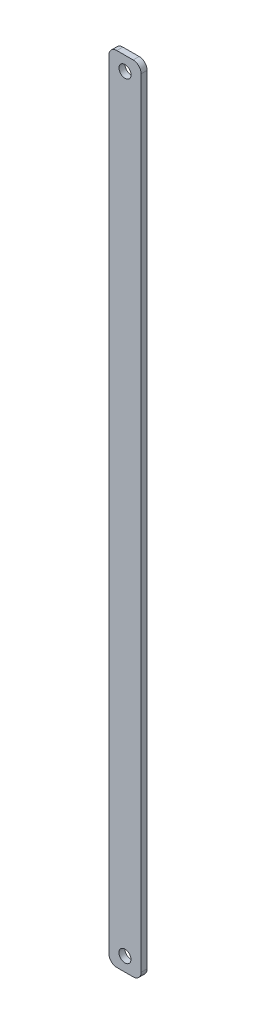
ISO-10303-21;
HEADER;
FILE_DESCRIPTION(('STEP AP214'),'2;1');
FILE_NAME('part.step','',(''),(''),'','','');
FILE_SCHEMA(('AUTOMOTIVE_DESIGN { 1 0 10303 214 1 1 1 1 }'));
ENDSEC;
DATA;
#1=APPLICATION_CONTEXT('core data for automotive mechanical design processes');
#2=APPLICATION_PROTOCOL_DEFINITION('international standard','automotive_design',2000,#1);
#3=PRODUCT_CONTEXT('',#1,'mechanical');
#4=PRODUCT('Part','Part','',(#3));
#5=PRODUCT_RELATED_PRODUCT_CATEGORY('part','',(#4));
#6=PRODUCT_DEFINITION_FORMATION('','',#4);
#7=PRODUCT_DEFINITION_CONTEXT('part definition',#1,'design');
#8=PRODUCT_DEFINITION('design','',#6,#7);
#9=PRODUCT_DEFINITION_SHAPE('','',#8);
#10=(LENGTH_UNIT() NAMED_UNIT(*) SI_UNIT(.MILLI.,.METRE.));
#11=(NAMED_UNIT(*) PLANE_ANGLE_UNIT() SI_UNIT($,.RADIAN.));
#12=(NAMED_UNIT(*) SI_UNIT($,.STERADIAN.) SOLID_ANGLE_UNIT());
#13=UNCERTAINTY_MEASURE_WITH_UNIT(LENGTH_MEASURE(1.E-05),#10,'distance_accuracy_value','');
#14=(GEOMETRIC_REPRESENTATION_CONTEXT(3) GLOBAL_UNCERTAINTY_ASSIGNED_CONTEXT((#13)) GLOBAL_UNIT_ASSIGNED_CONTEXT((#10,
#11,#12)) REPRESENTATION_CONTEXT('',''));
#15=CARTESIAN_POINT('',(0.,0.,0.));
#16=DIRECTION('',(0.,0.,1.));
#17=DIRECTION('',(1.,0.,0.));
#18=AXIS2_PLACEMENT_3D('',#15,#16,#17);
#19=CARTESIAN_POINT('',(4.035,198.5,0.75));
#20=DIRECTION('',(-1.,0.,0.));
#21=DIRECTION('',(0.,0.,1.));
#22=AXIS2_PLACEMENT_3D('',#19,#20,#21);
#23=PLANE('',#22);
#24=DIRECTION('',(0.,-1.,0.));
#25=VECTOR('',#24,1.);
#26=CARTESIAN_POINT('',(4.035,198.5,0.75));
#27=LINE('',#26,#25);
#28=CARTESIAN_POINT('',(4.035,196.5,0.75));
#29=VERTEX_POINT('',#28);
#30=CARTESIAN_POINT('',(4.035,2.,0.75));
#31=VERTEX_POINT('',#30);
#32=EDGE_CURVE('E126',#29,#31,#27,.T.);
#33=ORIENTED_EDGE('',*,*,#32,.T.);
#34=DIRECTION('',(0.,0.,-1.));
#35=VECTOR('',#34,1.);
#36=CARTESIAN_POINT('',(4.035,2.,-0.75));
#37=LINE('',#36,#35);
#38=CARTESIAN_POINT('',(4.035,2.,-0.75));
#39=VERTEX_POINT('',#38);
#40=EDGE_CURVE('E152',#31,#39,#37,.T.);
#41=ORIENTED_EDGE('',*,*,#40,.T.);
#42=DIRECTION('',(0.,-1.,0.));
#43=VECTOR('',#42,1.);
#44=CARTESIAN_POINT('',(4.035,198.5,-0.75));
#45=LINE('',#44,#43);
#46=CARTESIAN_POINT('',(4.035,196.5,-0.75));
#47=VERTEX_POINT('',#46);
#48=EDGE_CURVE('E131',#47,#39,#45,.T.);
#49=ORIENTED_EDGE('',*,*,#48,.F.);
#50=DIRECTION('',(0.,0.,-1.));
#51=VECTOR('',#50,1.);
#52=CARTESIAN_POINT('',(4.035,196.5,0.75));
#53=LINE('',#52,#51);
#54=EDGE_CURVE('E150',#47,#29,#53,.F.);
#55=ORIENTED_EDGE('',*,*,#54,.T.);
#56=EDGE_LOOP('',(#33,#41,#49,#55));
#57=FACE_BOUND('',#56,.T.);
#58=ADVANCED_FACE('F38',(#57),#23,.F.);
#59=CARTESIAN_POINT('',(-4.035,198.5,-0.75));
#60=DIRECTION('',(0.,0.,1.));
#61=DIRECTION('',(1.,0.,0.));
#62=AXIS2_PLACEMENT_3D('',#59,#60,#61);
#63=PLANE('',#62);
#64=CARTESIAN_POINT('',(-0.00500000000000066,3.49999642856961,-0.75));
#65=DIRECTION('',(0.,0.,1.));
#66=DIRECTION('',(1.,0.,0.));
#67=AXIS2_PLACEMENT_3D('',#64,#65,#66);
#68=CIRCLE('',#67,1.5);
#69=CARTESIAN_POINT('',(1.495,3.49999642856961,-0.75));
#70=VERTEX_POINT('',#69);
#71=EDGE_CURVE('E173',#70,#70,#68,.F.);
#72=ORIENTED_EDGE('',*,*,#71,.F.);
#73=EDGE_LOOP('',(#72));
#74=FACE_BOUND('',#73,.T.);
#75=CARTESIAN_POINT('',(0.00499999999997378,195.,-0.75));
#76=DIRECTION('',(0.,0.,1.));
#77=DIRECTION('',(1.,0.,0.));
#78=AXIS2_PLACEMENT_3D('',#75,#76,#77);
#79=CIRCLE('',#78,1.5);
#80=CARTESIAN_POINT('',(1.50499999999998,195.,-0.75));
#81=VERTEX_POINT('',#80);
#82=EDGE_CURVE('E170',#81,#81,#79,.F.);
#83=ORIENTED_EDGE('',*,*,#82,.F.);
#84=EDGE_LOOP('',(#83));
#85=FACE_BOUND('',#84,.T.);
#86=DIRECTION('',(-1.,0.,0.));
#87=VECTOR('',#86,1.);
#88=CARTESIAN_POINT('',(-4.035,0.,-0.75));
#89=LINE('',#88,#87);
#90=CARTESIAN_POINT('',(2.035,0.,-0.75));
#91=VERTEX_POINT('',#90);
#92=CARTESIAN_POINT('',(-2.035,0.,-0.75));
#93=VERTEX_POINT('',#92);
#94=EDGE_CURVE('E167',#91,#93,#89,.T.);
#95=ORIENTED_EDGE('',*,*,#94,.T.);
#96=CARTESIAN_POINT('',(-2.035,2.,-0.75));
#97=DIRECTION('',(0.,0.,1.));
#98=DIRECTION('',(1.,0.,0.));
#99=AXIS2_PLACEMENT_3D('',#96,#97,#98);
#100=CIRCLE('',#99,2.);
#101=CARTESIAN_POINT('',(-4.035,2.,-0.75));
#102=VERTEX_POINT('',#101);
#103=EDGE_CURVE('E148',#93,#102,#100,.F.);
#104=ORIENTED_EDGE('',*,*,#103,.T.);
#105=DIRECTION('',(0.,-1.,0.));
#106=VECTOR('',#105,1.);
#107=CARTESIAN_POINT('',(-4.035,198.5,-0.75));
#108=LINE('',#107,#106);
#109=CARTESIAN_POINT('',(-4.035,196.5,-0.75));
#110=VERTEX_POINT('',#109);
#111=EDGE_CURVE('E125',#110,#102,#108,.T.);
#112=ORIENTED_EDGE('',*,*,#111,.F.);
#113=CARTESIAN_POINT('',(-2.035,196.5,-0.75));
#114=DIRECTION('',(0.,0.,1.));
#115=DIRECTION('',(1.,0.,0.));
#116=AXIS2_PLACEMENT_3D('',#113,#114,#115);
#117=CIRCLE('',#116,2.);
#118=CARTESIAN_POINT('',(-2.035,198.5,-0.75));
#119=VERTEX_POINT('',#118);
#120=EDGE_CURVE('E130',#110,#119,#117,.F.);
#121=ORIENTED_EDGE('',*,*,#120,.T.);
#122=DIRECTION('',(-1.,0.,0.));
#123=VECTOR('',#122,1.);
#124=CARTESIAN_POINT('',(-4.035,198.5,-0.75));
#125=LINE('',#124,#123);
#126=CARTESIAN_POINT('',(2.035,198.5,-0.75));
#127=VERTEX_POINT('',#126);
#128=EDGE_CURVE('E158',#127,#119,#125,.T.);
#129=ORIENTED_EDGE('',*,*,#128,.F.);
#130=CARTESIAN_POINT('',(2.035,196.5,-0.75));
#131=DIRECTION('',(0.,0.,1.));
#132=DIRECTION('',(1.,0.,0.));
#133=AXIS2_PLACEMENT_3D('',#130,#131,#132);
#134=CIRCLE('',#133,2.);
#135=EDGE_CURVE('E61',#127,#47,#134,.F.);
#136=ORIENTED_EDGE('',*,*,#135,.T.);
#137=ORIENTED_EDGE('',*,*,#48,.T.);
#138=CARTESIAN_POINT('',(2.035,2.,-0.75));
#139=DIRECTION('',(0.,0.,1.));
#140=DIRECTION('',(1.,0.,0.));
#141=AXIS2_PLACEMENT_3D('',#138,#139,#140);
#142=CIRCLE('',#141,2.);
#143=EDGE_CURVE('E53',#39,#91,#142,.F.);
#144=ORIENTED_EDGE('',*,*,#143,.T.);
#145=EDGE_LOOP('',(#95,#104,#112,#121,#129,#136,#137,#144));
#146=FACE_BOUND('',#145,.T.);
#147=ADVANCED_FACE('F162',(#74,#85,#146),#63,.F.);
#148=CARTESIAN_POINT('',(-4.035,198.5,0.75));
#149=DIRECTION('',(1.,0.,0.));
#150=DIRECTION('',(0.,0.,-1.));
#151=AXIS2_PLACEMENT_3D('',#148,#149,#150);
#152=PLANE('',#151);
#153=ORIENTED_EDGE('',*,*,#111,.T.);
#154=DIRECTION('',(0.,0.,1.));
#155=VECTOR('',#154,1.);
#156=CARTESIAN_POINT('',(-4.035,2.,0.75));
#157=LINE('',#156,#155);
#158=CARTESIAN_POINT('',(-4.035,2.,0.75));
#159=VERTEX_POINT('',#158);
#160=EDGE_CURVE('E124',#102,#159,#157,.T.);
#161=ORIENTED_EDGE('',*,*,#160,.T.);
#162=DIRECTION('',(0.,-1.,0.));
#163=VECTOR('',#162,1.);
#164=CARTESIAN_POINT('',(-4.035,198.5,0.75));
#165=LINE('',#164,#163);
#166=CARTESIAN_POINT('',(-4.035,196.5,0.75));
#167=VERTEX_POINT('',#166);
#168=EDGE_CURVE('E108',#167,#159,#165,.T.);
#169=ORIENTED_EDGE('',*,*,#168,.F.);
#170=DIRECTION('',(0.,0.,1.));
#171=VECTOR('',#170,1.);
#172=CARTESIAN_POINT('',(-4.035,196.5,0.75));
#173=LINE('',#172,#171);
#174=EDGE_CURVE('E121',#167,#110,#173,.F.);
#175=ORIENTED_EDGE('',*,*,#174,.T.);
#176=EDGE_LOOP('',(#153,#161,#169,#175));
#177=FACE_BOUND('',#176,.T.);
#178=ADVANCED_FACE('F120',(#177),#152,.F.);
#179=CARTESIAN_POINT('',(-4.035,198.5,0.75));
#180=DIRECTION('',(0.,0.,-1.));
#181=DIRECTION('',(-1.,0.,0.));
#182=AXIS2_PLACEMENT_3D('',#179,#180,#181);
#183=PLANE('',#182);
#184=CARTESIAN_POINT('',(-0.00500000000000066,3.49999642856961,0.75));
#185=DIRECTION('',(0.,0.,1.));
#186=DIRECTION('',(1.,0.,0.));
#187=AXIS2_PLACEMENT_3D('',#184,#185,#186);
#188=CIRCLE('',#187,1.5);
#189=CARTESIAN_POINT('',(1.495,3.49999642856961,0.75));
#190=VERTEX_POINT('',#189);
#191=EDGE_CURVE('E292',#190,#190,#188,.T.);
#192=ORIENTED_EDGE('',*,*,#191,.F.);
#193=EDGE_LOOP('',(#192));
#194=FACE_BOUND('',#193,.T.);
#195=CARTESIAN_POINT('',(0.00499999999997378,195.,0.75));
#196=DIRECTION('',(0.,0.,1.));
#197=DIRECTION('',(-1.,0.,0.));
#198=AXIS2_PLACEMENT_3D('',#195,#196,#197);
#199=CIRCLE('',#198,1.5);
#200=CARTESIAN_POINT('',(-1.49500000000003,195.,0.75));
#201=VERTEX_POINT('',#200);
#202=EDGE_CURVE('E295',#201,#201,#199,.T.);
#203=ORIENTED_EDGE('',*,*,#202,.F.);
#204=EDGE_LOOP('',(#203));
#205=FACE_BOUND('',#204,.T.);
#206=ORIENTED_EDGE('',*,*,#168,.T.);
#207=CARTESIAN_POINT('',(-2.035,2.,0.75));
#208=DIRECTION('',(0.,0.,-1.));
#209=DIRECTION('',(-1.,0.,0.));
#210=AXIS2_PLACEMENT_3D('',#207,#208,#209);
#211=CIRCLE('',#210,2.);
#212=CARTESIAN_POINT('',(-2.035,0.,0.75));
#213=VERTEX_POINT('',#212);
#214=EDGE_CURVE('E139',#159,#213,#211,.F.);
#215=ORIENTED_EDGE('',*,*,#214,.T.);
#216=DIRECTION('',(1.,0.,0.));
#217=VECTOR('',#216,1.);
#218=CARTESIAN_POINT('',(-4.035,0.,0.75));
#219=LINE('',#218,#217);
#220=CARTESIAN_POINT('',(2.035,0.,0.75));
#221=VERTEX_POINT('',#220);
#222=EDGE_CURVE('E163',#213,#221,#219,.T.);
#223=ORIENTED_EDGE('',*,*,#222,.T.);
#224=CARTESIAN_POINT('',(2.035,2.,0.75));
#225=DIRECTION('',(0.,0.,-1.));
#226=DIRECTION('',(-1.,0.,0.));
#227=AXIS2_PLACEMENT_3D('',#224,#225,#226);
#228=CIRCLE('',#227,2.);
#229=EDGE_CURVE('E114',#221,#31,#228,.F.);
#230=ORIENTED_EDGE('',*,*,#229,.T.);
#231=ORIENTED_EDGE('',*,*,#32,.F.);
#232=CARTESIAN_POINT('',(2.035,196.5,0.75));
#233=DIRECTION('',(0.,0.,-1.));
#234=DIRECTION('',(-1.,0.,0.));
#235=AXIS2_PLACEMENT_3D('',#232,#233,#234);
#236=CIRCLE('',#235,2.);
#237=CARTESIAN_POINT('',(2.035,198.5,0.75));
#238=VERTEX_POINT('',#237);
#239=EDGE_CURVE('E115',#29,#238,#236,.F.);
#240=ORIENTED_EDGE('',*,*,#239,.T.);
#241=DIRECTION('',(1.,0.,0.));
#242=VECTOR('',#241,1.);
#243=CARTESIAN_POINT('',(-4.035,198.5,0.75));
#244=LINE('',#243,#242);
#245=CARTESIAN_POINT('',(-2.035,198.5,0.75));
#246=VERTEX_POINT('',#245);
#247=EDGE_CURVE('E110',#246,#238,#244,.T.);
#248=ORIENTED_EDGE('',*,*,#247,.F.);
#249=CARTESIAN_POINT('',(-2.035,196.5,0.75));
#250=DIRECTION('',(0.,0.,-1.));
#251=DIRECTION('',(-1.,0.,0.));
#252=AXIS2_PLACEMENT_3D('',#249,#250,#251);
#253=CIRCLE('',#252,2.);
#254=EDGE_CURVE('E105',#246,#167,#253,.F.);
#255=ORIENTED_EDGE('',*,*,#254,.T.);
#256=EDGE_LOOP('',(#206,#215,#223,#230,#231,#240,#248,#255));
#257=FACE_BOUND('',#256,.T.);
#258=ADVANCED_FACE('F107',(#194,#205,#257),#183,.F.);
#259=CARTESIAN_POINT('',(0.,198.5,0.));
#260=DIRECTION('',(0.,-1.,0.));
#261=DIRECTION('',(0.,0.,-1.));
#262=AXIS2_PLACEMENT_3D('',#259,#260,#261);
#263=PLANE('',#262);
#264=ORIENTED_EDGE('',*,*,#128,.T.);
#265=DIRECTION('',(0.,0.,1.));
#266=VECTOR('',#265,1.);
#267=CARTESIAN_POINT('',(-2.035,198.5,0.));
#268=LINE('',#267,#266);
#269=EDGE_CURVE('E11',#119,#246,#268,.T.);
#270=ORIENTED_EDGE('',*,*,#269,.T.);
#271=ORIENTED_EDGE('',*,*,#247,.T.);
#272=DIRECTION('',(0.,0.,-1.));
#273=VECTOR('',#272,1.);
#274=CARTESIAN_POINT('',(2.035,198.5,0.));
#275=LINE('',#274,#273);
#276=EDGE_CURVE('E46',#238,#127,#275,.T.);
#277=ORIENTED_EDGE('',*,*,#276,.T.);
#278=EDGE_LOOP('',(#264,#270,#271,#277));
#279=FACE_BOUND('',#278,.T.);
#280=ADVANCED_FACE('F157',(#279),#263,.F.);
#281=CARTESIAN_POINT('',(0.,0.,0.));
#282=DIRECTION('',(0.,-1.,0.));
#283=DIRECTION('',(0.,0.,-1.));
#284=AXIS2_PLACEMENT_3D('',#281,#282,#283);
#285=PLANE('',#284);
#286=ORIENTED_EDGE('',*,*,#222,.F.);
#287=DIRECTION('',(0.,0.,1.));
#288=VECTOR('',#287,1.);
#289=CARTESIAN_POINT('',(-2.035,0.,-0.75));
#290=LINE('',#289,#288);
#291=EDGE_CURVE('E143',#213,#93,#290,.F.);
#292=ORIENTED_EDGE('',*,*,#291,.T.);
#293=ORIENTED_EDGE('',*,*,#94,.F.);
#294=DIRECTION('',(0.,0.,-1.));
#295=VECTOR('',#294,1.);
#296=CARTESIAN_POINT('',(2.035,0.,0.75));
#297=LINE('',#296,#295);
#298=EDGE_CURVE('E141',#91,#221,#297,.F.);
#299=ORIENTED_EDGE('',*,*,#298,.T.);
#300=EDGE_LOOP('',(#286,#292,#293,#299));
#301=FACE_BOUND('',#300,.T.);
#302=ADVANCED_FACE('F183',(#301),#285,.T.);
#303=CARTESIAN_POINT('',(0.00499999999997378,195.,-4.99264068711929));
#304=DIRECTION('',(0.,0.,1.));
#305=DIRECTION('',(1.,0.,0.));
#306=AXIS2_PLACEMENT_3D('',#303,#304,#305);
#307=CYLINDRICAL_SURFACE('',#306,1.5);
#308=ORIENTED_EDGE('',*,*,#82,.T.);
#309=EDGE_LOOP('',(#308));
#310=FACE_BOUND('',#309,.T.);
#311=ORIENTED_EDGE('',*,*,#202,.T.);
#312=EDGE_LOOP('',(#311));
#313=FACE_BOUND('',#312,.T.);
#314=ADVANCED_FACE('F235',(#310,#313),#307,.F.);
#315=CARTESIAN_POINT('',(-0.00500000000000066,3.49999642856961,-4.99264068711929));
#316=DIRECTION('',(0.,0.,1.));
#317=DIRECTION('',(1.,0.,0.));
#318=AXIS2_PLACEMENT_3D('',#315,#316,#317);
#319=CYLINDRICAL_SURFACE('',#318,1.5);
#320=ORIENTED_EDGE('',*,*,#71,.T.);
#321=EDGE_LOOP('',(#320));
#322=FACE_BOUND('',#321,.T.);
#323=ORIENTED_EDGE('',*,*,#191,.T.);
#324=EDGE_LOOP('',(#323));
#325=FACE_BOUND('',#324,.T.);
#326=ADVANCED_FACE('F204',(#322,#325),#319,.F.);
#327=CARTESIAN_POINT('',(-2.035,2.,0.75));
#328=DIRECTION('',(0.,0.,-1.));
#329=DIRECTION('',(-1.,0.,0.));
#330=AXIS2_PLACEMENT_3D('',#327,#328,#329);
#331=CYLINDRICAL_SURFACE('',#330,2.);
#332=ORIENTED_EDGE('',*,*,#103,.F.);
#333=ORIENTED_EDGE('',*,*,#291,.F.);
#334=ORIENTED_EDGE('',*,*,#214,.F.);
#335=ORIENTED_EDGE('',*,*,#160,.F.);
#336=EDGE_LOOP('',(#332,#333,#334,#335));
#337=FACE_BOUND('',#336,.T.);
#338=ADVANCED_FACE('F178',(#337),#331,.T.);
#339=CARTESIAN_POINT('',(2.035,2.,0.75));
#340=DIRECTION('',(0.,0.,1.));
#341=DIRECTION('',(1.,0.,0.));
#342=AXIS2_PLACEMENT_3D('',#339,#340,#341);
#343=CYLINDRICAL_SURFACE('',#342,2.);
#344=ORIENTED_EDGE('',*,*,#229,.F.);
#345=ORIENTED_EDGE('',*,*,#298,.F.);
#346=ORIENTED_EDGE('',*,*,#143,.F.);
#347=ORIENTED_EDGE('',*,*,#40,.F.);
#348=EDGE_LOOP('',(#344,#345,#346,#347));
#349=FACE_BOUND('',#348,.T.);
#350=ADVANCED_FACE('F185',(#349),#343,.T.);
#351=CARTESIAN_POINT('',(-2.035,196.5,0.));
#352=DIRECTION('',(0.,0.,1.));
#353=DIRECTION('',(1.,0.,0.));
#354=AXIS2_PLACEMENT_3D('',#351,#352,#353);
#355=CYLINDRICAL_SURFACE('',#354,2.);
#356=ORIENTED_EDGE('',*,*,#120,.F.);
#357=ORIENTED_EDGE('',*,*,#174,.F.);
#358=ORIENTED_EDGE('',*,*,#254,.F.);
#359=ORIENTED_EDGE('',*,*,#269,.F.);
#360=EDGE_LOOP('',(#356,#357,#358,#359));
#361=FACE_BOUND('',#360,.T.);
#362=ADVANCED_FACE('F129',(#361),#355,.T.);
#363=CARTESIAN_POINT('',(2.035,196.5,0.));
#364=DIRECTION('',(0.,0.,-1.));
#365=DIRECTION('',(-1.,0.,0.));
#366=AXIS2_PLACEMENT_3D('',#363,#364,#365);
#367=CYLINDRICAL_SURFACE('',#366,2.);
#368=ORIENTED_EDGE('',*,*,#239,.F.);
#369=ORIENTED_EDGE('',*,*,#54,.F.);
#370=ORIENTED_EDGE('',*,*,#135,.F.);
#371=ORIENTED_EDGE('',*,*,#276,.F.);
#372=EDGE_LOOP('',(#368,#369,#370,#371));
#373=FACE_BOUND('',#372,.T.);
#374=ADVANCED_FACE('F40',(#373),#367,.T.);
#375=CLOSED_SHELL('',(#58,#147,#178,#258,#280,#302,#314,#326,#338,#350,#362,#374));
#376=MANIFOLD_SOLID_BREP('B2',#375);
#377=ADVANCED_BREP_SHAPE_REPRESENTATION('',(#18,#376),#14);
#378=SHAPE_DEFINITION_REPRESENTATION(#9,#377);
ENDSEC;
END-ISO-10303-21;
